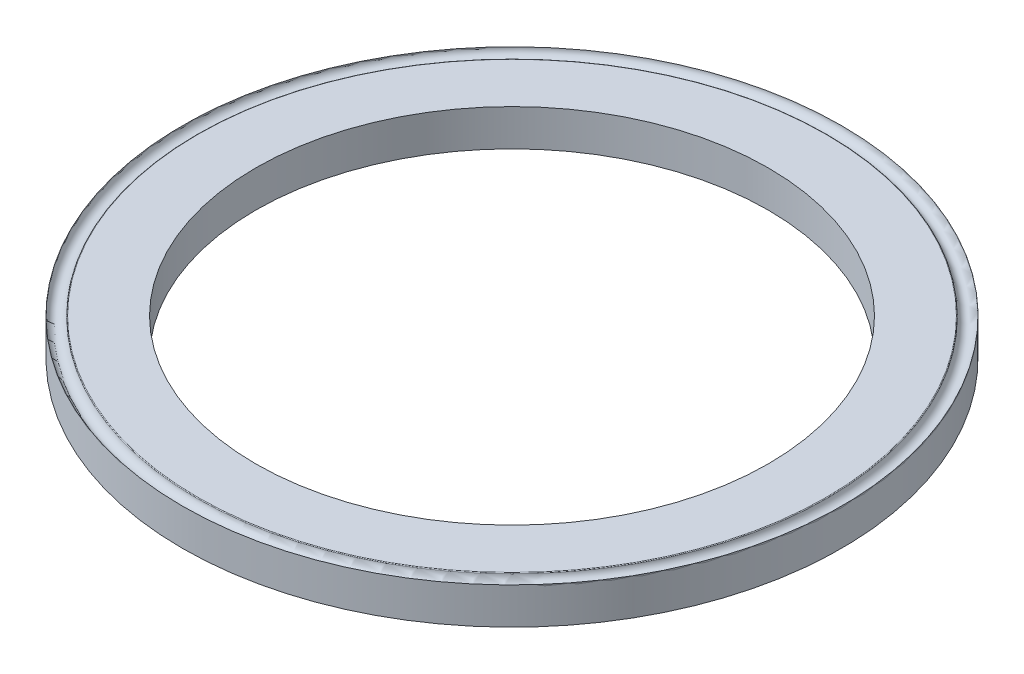
ISO-10303-21;
HEADER;
FILE_DESCRIPTION(('STEP AP214'),'2;1');
FILE_NAME('part.step','',(''),(''),'','','');
FILE_SCHEMA(('AUTOMOTIVE_DESIGN { 1 0 10303 214 1 1 1 1 }'));
ENDSEC;
DATA;
#1=APPLICATION_CONTEXT('core data for automotive mechanical design processes');
#2=APPLICATION_PROTOCOL_DEFINITION('international standard','automotive_design',2000,#1);
#3=PRODUCT_CONTEXT('',#1,'mechanical');
#4=PRODUCT('Part','Part','',(#3));
#5=PRODUCT_RELATED_PRODUCT_CATEGORY('part','',(#4));
#6=PRODUCT_DEFINITION_FORMATION('','',#4);
#7=PRODUCT_DEFINITION_CONTEXT('part definition',#1,'design');
#8=PRODUCT_DEFINITION('design','',#6,#7);
#9=PRODUCT_DEFINITION_SHAPE('','',#8);
#10=(LENGTH_UNIT() NAMED_UNIT(*) SI_UNIT(.MILLI.,.METRE.));
#11=(NAMED_UNIT(*) PLANE_ANGLE_UNIT() SI_UNIT($,.RADIAN.));
#12=(NAMED_UNIT(*) SI_UNIT($,.STERADIAN.) SOLID_ANGLE_UNIT());
#13=UNCERTAINTY_MEASURE_WITH_UNIT(LENGTH_MEASURE(1.E-05),#10,'distance_accuracy_value','');
#14=(GEOMETRIC_REPRESENTATION_CONTEXT(3) GLOBAL_UNCERTAINTY_ASSIGNED_CONTEXT((#13)) GLOBAL_UNIT_ASSIGNED_CONTEXT((#10,
#11,#12)) REPRESENTATION_CONTEXT('',''));
#15=CARTESIAN_POINT('',(0.,0.,0.));
#16=DIRECTION('',(0.,0.,1.));
#17=DIRECTION('',(1.,0.,0.));
#18=AXIS2_PLACEMENT_3D('',#15,#16,#17);
#19=CARTESIAN_POINT('',(0.,0.25,0.));
#20=DIRECTION('',(0.,1.,0.));
#21=DIRECTION('',(0.,0.,1.));
#22=AXIS2_PLACEMENT_3D('',#19,#20,#21);
#23=PLANE('',#22);
#24=CARTESIAN_POINT('',(0.,0.25,0.));
#25=DIRECTION('',(0.,1.,0.));
#26=DIRECTION('',(0.,0.,1.));
#27=AXIS2_PLACEMENT_3D('',#24,#25,#26);
#28=CIRCLE('',#27,4.29045548849897);
#29=CARTESIAN_POINT('',(0.,0.25,4.29045548849897));
#30=VERTEX_POINT('',#29);
#31=EDGE_CURVE('E55',#30,#30,#28,.T.);
#32=ORIENTED_EDGE('',*,*,#31,.T.);
#33=EDGE_LOOP('',(#32));
#34=FACE_BOUND('',#33,.T.);
#35=CARTESIAN_POINT('',(0.,0.25,0.));
#36=DIRECTION('',(0.,1.,0.));
#37=DIRECTION('',(0.,0.,1.));
#38=AXIS2_PLACEMENT_3D('',#35,#36,#37);
#39=CIRCLE('',#38,3.5);
#40=CARTESIAN_POINT('',(0.,0.25,3.5));
#41=VERTEX_POINT('',#40);
#42=EDGE_CURVE('E39',#41,#41,#39,.T.);
#43=ORIENTED_EDGE('',*,*,#42,.F.);
#44=EDGE_LOOP('',(#43));
#45=FACE_BOUND('',#44,.T.);
#46=ADVANCED_FACE('F32',(#34,#45),#23,.T.);
#47=CARTESIAN_POINT('',(0.,-0.25,0.));
#48=DIRECTION('',(0.,1.,0.));
#49=DIRECTION('',(0.,0.,1.));
#50=AXIS2_PLACEMENT_3D('',#47,#48,#49);
#51=PLANE('',#50);
#52=CARTESIAN_POINT('',(0.,-0.25,0.));
#53=DIRECTION('',(0.,1.,0.));
#54=DIRECTION('',(0.,0.,1.));
#55=AXIS2_PLACEMENT_3D('',#52,#53,#54);
#56=CIRCLE('',#55,4.5);
#57=CARTESIAN_POINT('',(0.,-0.25,4.5));
#58=VERTEX_POINT('',#57);
#59=EDGE_CURVE('E10',#58,#58,#56,.T.);
#60=ORIENTED_EDGE('',*,*,#59,.F.);
#61=EDGE_LOOP('',(#60));
#62=FACE_BOUND('',#61,.T.);
#63=CARTESIAN_POINT('',(0.,-0.25,0.));
#64=DIRECTION('',(0.,1.,0.));
#65=DIRECTION('',(0.,0.,1.));
#66=AXIS2_PLACEMENT_3D('',#63,#64,#65);
#67=CIRCLE('',#66,3.5);
#68=CARTESIAN_POINT('',(0.,-0.25,3.5));
#69=VERTEX_POINT('',#68);
#70=EDGE_CURVE('E43',#69,#69,#67,.T.);
#71=ORIENTED_EDGE('',*,*,#70,.T.);
#72=EDGE_LOOP('',(#71));
#73=FACE_BOUND('',#72,.T.);
#74=ADVANCED_FACE('F75',(#62,#73),#51,.F.);
#75=CARTESIAN_POINT('',(0.,0.25,0.));
#76=DIRECTION('',(0.,-1.,0.));
#77=DIRECTION('',(0.,0.,-1.));
#78=AXIS2_PLACEMENT_3D('',#75,#76,#77);
#79=CYLINDRICAL_SURFACE('',#78,4.5);
#80=CARTESIAN_POINT('',(0.,0.25,0.));
#81=DIRECTION('',(0.,1.,0.));
#82=DIRECTION('',(0.,0.,1.));
#83=AXIS2_PLACEMENT_3D('',#80,#81,#82);
#84=CIRCLE('',#83,4.5);
#85=CARTESIAN_POINT('',(0.,0.25,4.5));
#86=VERTEX_POINT('',#85);
#87=EDGE_CURVE('E52',#86,#86,#84,.T.);
#88=ORIENTED_EDGE('',*,*,#87,.F.);
#89=EDGE_LOOP('',(#88));
#90=FACE_BOUND('',#89,.T.);
#91=ORIENTED_EDGE('',*,*,#59,.T.);
#92=EDGE_LOOP('',(#91));
#93=FACE_BOUND('',#92,.T.);
#94=ADVANCED_FACE('F34',(#90,#93),#79,.T.);
#95=CARTESIAN_POINT('',(0.,0.25,0.));
#96=DIRECTION('',(0.,-1.,0.));
#97=DIRECTION('',(0.,0.,-1.));
#98=AXIS2_PLACEMENT_3D('',#95,#96,#97);
#99=CYLINDRICAL_SURFACE('',#98,3.5);
#100=ORIENTED_EDGE('',*,*,#42,.T.);
#101=EDGE_LOOP('',(#100));
#102=FACE_BOUND('',#101,.T.);
#103=ORIENTED_EDGE('',*,*,#70,.F.);
#104=EDGE_LOOP('',(#103));
#105=FACE_BOUND('',#104,.T.);
#106=ADVANCED_FACE('F65',(#102,#105),#99,.F.);
#107=CARTESIAN_POINT('',(0.,0.24,0.));
#108=DIRECTION('',(0.,1.,0.));
#109=DIRECTION('',(0.,0.,1.));
#110=AXIS2_PLACEMENT_3D('',#107,#108,#109);
#111=TOROIDAL_SURFACE('',#110,4.29045548849897,0.00999999999999979);
#112=ORIENTED_EDGE('',*,*,#31,.F.);
#113=EDGE_LOOP('',(#112));
#114=FACE_BOUND('',#113,.T.);
#115=CARTESIAN_POINT('',(0.,0.240909090909091,0.));
#116=DIRECTION('',(0.,1.,0.));
#117=DIRECTION('',(0.,0.,1.));
#118=AXIS2_PLACEMENT_3D('',#115,#116,#117);
#119=CIRCLE('',#118,4.30041408045361);
#120=CARTESIAN_POINT('',(0.,0.240909090909091,4.30041408045361));
#121=VERTEX_POINT('',#120);
#122=EDGE_CURVE('E48',#121,#121,#119,.T.);
#123=ORIENTED_EDGE('',*,*,#122,.T.);
#124=EDGE_LOOP('',(#123));
#125=FACE_BOUND('',#124,.T.);
#126=ADVANCED_FACE('F61',(#114,#125),#111,.T.);
#127=CARTESIAN_POINT('',(0.,0.25,0.));
#128=DIRECTION('',(0.,1.,0.));
#129=DIRECTION('',(0.,0.,1.));
#130=AXIS2_PLACEMENT_3D('',#127,#128,#129);
#131=TOROIDAL_SURFACE('',#130,4.4,0.1);
#132=ORIENTED_EDGE('',*,*,#122,.F.);
#133=EDGE_LOOP('',(#132));
#134=FACE_BOUND('',#133,.T.);
#135=ORIENTED_EDGE('',*,*,#87,.T.);
#136=EDGE_LOOP('',(#135));
#137=FACE_BOUND('',#136,.T.);
#138=ADVANCED_FACE('F64',(#134,#137),#131,.F.);
#139=CLOSED_SHELL('',(#46,#74,#94,#106,#126,#138));
#140=MANIFOLD_SOLID_BREP('B2',#139);
#141=ADVANCED_BREP_SHAPE_REPRESENTATION('',(#18,#140),#14);
#142=SHAPE_DEFINITION_REPRESENTATION(#9,#141);
ENDSEC;
END-ISO-10303-21;
